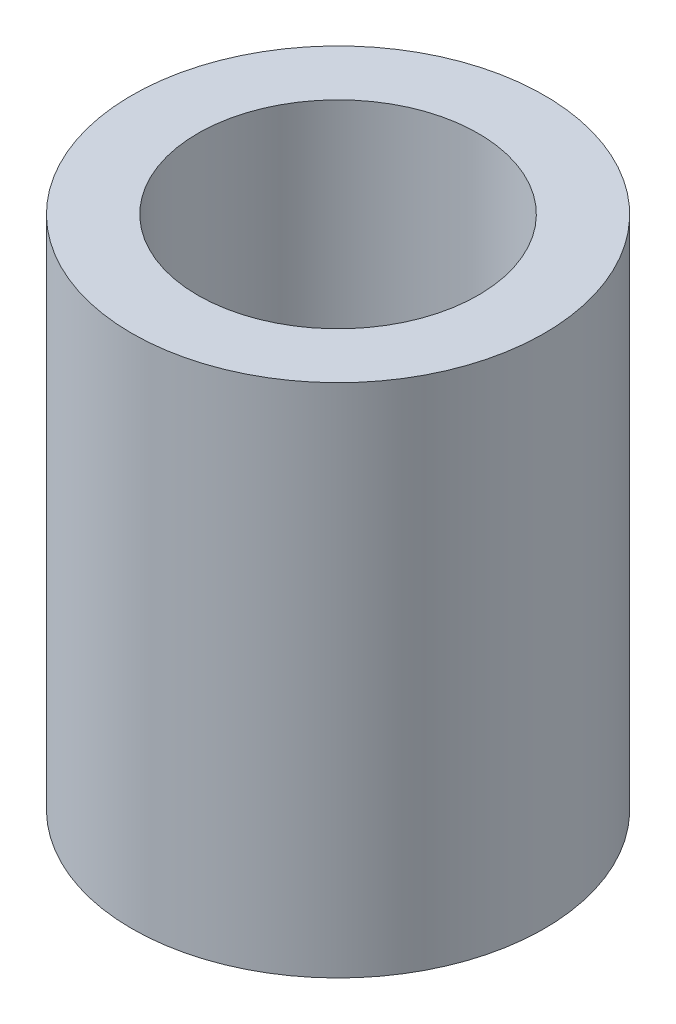
ISO-10303-21;
HEADER;
FILE_DESCRIPTION(('STEP AP214'),'2;1');
FILE_NAME('part.step','',(''),(''),'','','');
FILE_SCHEMA(('AUTOMOTIVE_DESIGN { 1 0 10303 214 1 1 1 1 }'));
ENDSEC;
DATA;
#1=APPLICATION_CONTEXT('core data for automotive mechanical design processes');
#2=APPLICATION_PROTOCOL_DEFINITION('international standard','automotive_design',2000,#1);
#3=PRODUCT_CONTEXT('',#1,'mechanical');
#4=PRODUCT('Part','Part','',(#3));
#5=PRODUCT_RELATED_PRODUCT_CATEGORY('part','',(#4));
#6=PRODUCT_DEFINITION_FORMATION('','',#4);
#7=PRODUCT_DEFINITION_CONTEXT('part definition',#1,'design');
#8=PRODUCT_DEFINITION('design','',#6,#7);
#9=PRODUCT_DEFINITION_SHAPE('','',#8);
#10=(LENGTH_UNIT() NAMED_UNIT(*) SI_UNIT(.MILLI.,.METRE.));
#11=(NAMED_UNIT(*) PLANE_ANGLE_UNIT() SI_UNIT($,.RADIAN.));
#12=(NAMED_UNIT(*) SI_UNIT($,.STERADIAN.) SOLID_ANGLE_UNIT());
#13=UNCERTAINTY_MEASURE_WITH_UNIT(LENGTH_MEASURE(1.E-05),#10,'distance_accuracy_value','');
#14=(GEOMETRIC_REPRESENTATION_CONTEXT(3) GLOBAL_UNCERTAINTY_ASSIGNED_CONTEXT((#13)) GLOBAL_UNIT_ASSIGNED_CONTEXT((#10,
#11,#12)) REPRESENTATION_CONTEXT('',''));
#15=CARTESIAN_POINT('',(0.,0.,0.));
#16=DIRECTION('',(0.,0.,1.));
#17=DIRECTION('',(1.,0.,0.));
#18=AXIS2_PLACEMENT_3D('',#15,#16,#17);
#19=CARTESIAN_POINT('',(0.,6.25,0.));
#20=DIRECTION('',(0.,1.,0.));
#21=DIRECTION('',(0.,0.,1.));
#22=AXIS2_PLACEMENT_3D('',#19,#20,#21);
#23=PLANE('',#22);
#24=CARTESIAN_POINT('',(0.,6.25,0.));
#25=DIRECTION('',(0.,1.,0.));
#26=DIRECTION('',(0.,0.,1.));
#27=AXIS2_PLACEMENT_3D('',#24,#25,#26);
#28=CIRCLE('',#27,2.5);
#29=CARTESIAN_POINT('',(0.,6.25,2.5));
#30=VERTEX_POINT('',#29);
#31=EDGE_CURVE('E10',#30,#30,#28,.T.);
#32=ORIENTED_EDGE('',*,*,#31,.T.);
#33=EDGE_LOOP('',(#32));
#34=FACE_BOUND('',#33,.T.);
#35=CARTESIAN_POINT('',(0.,6.25,0.));
#36=DIRECTION('',(0.,1.,0.));
#37=DIRECTION('',(0.,0.,1.));
#38=AXIS2_PLACEMENT_3D('',#35,#36,#37);
#39=CIRCLE('',#38,1.7);
#40=CARTESIAN_POINT('',(0.,6.25,1.7));
#41=VERTEX_POINT('',#40);
#42=EDGE_CURVE('E50',#41,#41,#39,.T.);
#43=ORIENTED_EDGE('',*,*,#42,.F.);
#44=EDGE_LOOP('',(#43));
#45=FACE_BOUND('',#44,.T.);
#46=ADVANCED_FACE('F39',(#34,#45),#23,.T.);
#47=CARTESIAN_POINT('',(0.,0.,0.));
#48=DIRECTION('',(0.,1.,0.));
#49=DIRECTION('',(0.,0.,1.));
#50=AXIS2_PLACEMENT_3D('',#47,#48,#49);
#51=PLANE('',#50);
#52=CARTESIAN_POINT('',(0.,0.,0.));
#53=DIRECTION('',(0.,1.,0.));
#54=DIRECTION('',(0.,0.,1.));
#55=AXIS2_PLACEMENT_3D('',#52,#53,#54);
#56=CIRCLE('',#55,2.5);
#57=CARTESIAN_POINT('',(0.,0.,2.5));
#58=VERTEX_POINT('',#57);
#59=EDGE_CURVE('E43',#58,#58,#56,.T.);
#60=ORIENTED_EDGE('',*,*,#59,.F.);
#61=EDGE_LOOP('',(#60));
#62=FACE_BOUND('',#61,.T.);
#63=CARTESIAN_POINT('',(0.,0.,0.));
#64=DIRECTION('',(0.,1.,0.));
#65=DIRECTION('',(0.,0.,1.));
#66=AXIS2_PLACEMENT_3D('',#63,#64,#65);
#67=CIRCLE('',#66,1.7);
#68=CARTESIAN_POINT('',(0.,0.,1.7));
#69=VERTEX_POINT('',#68);
#70=EDGE_CURVE('E52',#69,#69,#67,.T.);
#71=ORIENTED_EDGE('',*,*,#70,.T.);
#72=EDGE_LOOP('',(#71));
#73=FACE_BOUND('',#72,.T.);
#74=ADVANCED_FACE('F62',(#62,#73),#51,.F.);
#75=CARTESIAN_POINT('',(0.,6.25,0.));
#76=DIRECTION('',(0.,-1.,0.));
#77=DIRECTION('',(0.,0.,-1.));
#78=AXIS2_PLACEMENT_3D('',#75,#76,#77);
#79=CYLINDRICAL_SURFACE('',#78,2.5);
#80=ORIENTED_EDGE('',*,*,#31,.F.);
#81=EDGE_LOOP('',(#80));
#82=FACE_BOUND('',#81,.T.);
#83=ORIENTED_EDGE('',*,*,#59,.T.);
#84=EDGE_LOOP('',(#83));
#85=FACE_BOUND('',#84,.T.);
#86=ADVANCED_FACE('F41',(#82,#85),#79,.T.);
#87=CARTESIAN_POINT('',(0.,6.25,0.));
#88=DIRECTION('',(0.,-1.,0.));
#89=DIRECTION('',(0.,0.,-1.));
#90=AXIS2_PLACEMENT_3D('',#87,#88,#89);
#91=CYLINDRICAL_SURFACE('',#90,1.7);
#92=ORIENTED_EDGE('',*,*,#42,.T.);
#93=EDGE_LOOP('',(#92));
#94=FACE_BOUND('',#93,.T.);
#95=ORIENTED_EDGE('',*,*,#70,.F.);
#96=EDGE_LOOP('',(#95));
#97=FACE_BOUND('',#96,.T.);
#98=ADVANCED_FACE('F58',(#94,#97),#91,.F.);
#99=CLOSED_SHELL('',(#46,#74,#86,#98));
#100=MANIFOLD_SOLID_BREP('B2',#99);
#101=ADVANCED_BREP_SHAPE_REPRESENTATION('',(#18,#100),#14);
#102=SHAPE_DEFINITION_REPRESENTATION(#9,#101);
ENDSEC;
END-ISO-10303-21;
